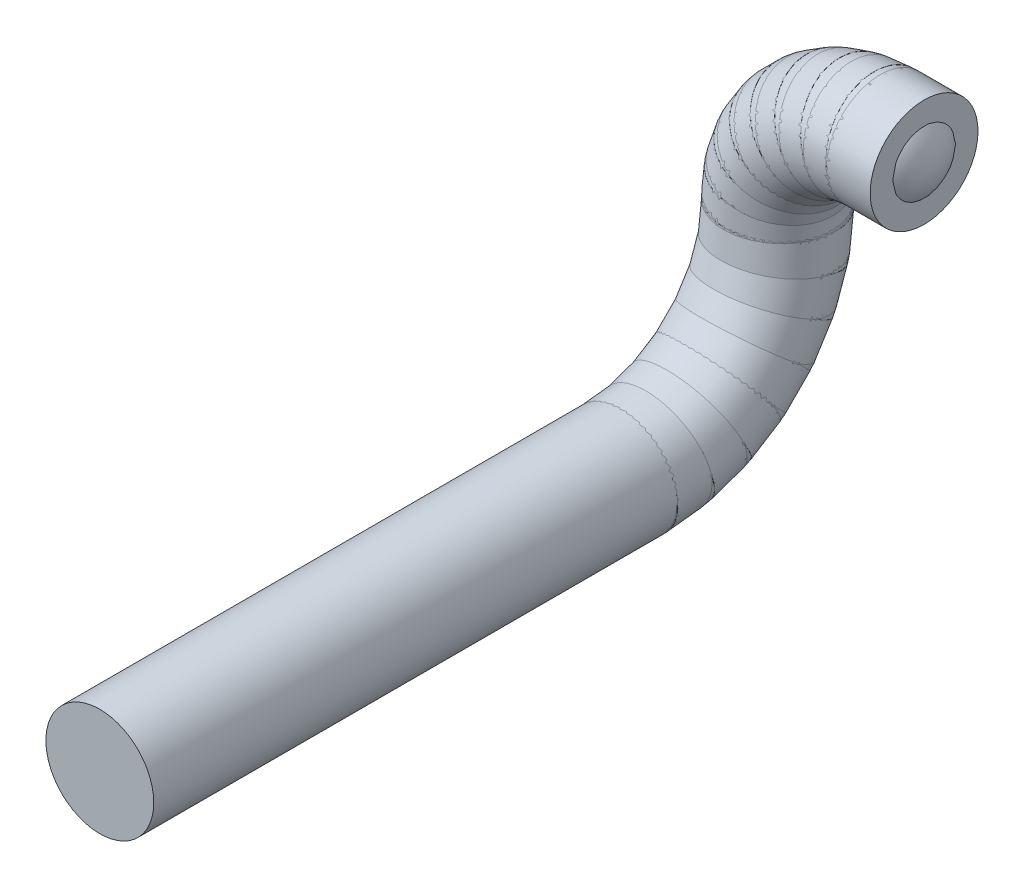
ISO-10303-21;
HEADER;
FILE_DESCRIPTION(('STEP AP214'),'2;1');
FILE_NAME('part.step','',(''),(''),'','','');
FILE_SCHEMA(('AUTOMOTIVE_DESIGN { 1 0 10303 214 1 1 1 1 }'));
ENDSEC;
DATA;
#1=APPLICATION_CONTEXT('core data for automotive mechanical design processes');
#2=APPLICATION_PROTOCOL_DEFINITION('international standard','automotive_design',2000,#1);
#3=PRODUCT_CONTEXT('',#1,'mechanical');
#4=PRODUCT('Part','Part','',(#3));
#5=PRODUCT_RELATED_PRODUCT_CATEGORY('part','',(#4));
#6=PRODUCT_DEFINITION_FORMATION('','',#4);
#7=PRODUCT_DEFINITION_CONTEXT('part definition',#1,'design');
#8=PRODUCT_DEFINITION('design','',#6,#7);
#9=PRODUCT_DEFINITION_SHAPE('','',#8);
#10=(LENGTH_UNIT() NAMED_UNIT(*) SI_UNIT(.MILLI.,.METRE.));
#11=(NAMED_UNIT(*) PLANE_ANGLE_UNIT() SI_UNIT($,.RADIAN.));
#12=(NAMED_UNIT(*) SI_UNIT($,.STERADIAN.) SOLID_ANGLE_UNIT());
#13=UNCERTAINTY_MEASURE_WITH_UNIT(LENGTH_MEASURE(1.E-05),#10,'distance_accuracy_value','');
#14=(GEOMETRIC_REPRESENTATION_CONTEXT(3) GLOBAL_UNCERTAINTY_ASSIGNED_CONTEXT((#13)) GLOBAL_UNIT_ASSIGNED_CONTEXT((#10,
#11,#12)) REPRESENTATION_CONTEXT('',''));
#15=CARTESIAN_POINT('',(0.,0.,0.));
#16=DIRECTION('',(0.,0.,1.));
#17=DIRECTION('',(1.,0.,0.));
#18=AXIS2_PLACEMENT_3D('',#15,#16,#17);
#19=CARTESIAN_POINT('',(-118.5,0.,57.));
#20=DIRECTION('',(-1.,0.,0.));
#21=DIRECTION('',(0.,0.,1.));
#22=AXIS2_PLACEMENT_3D('',#19,#20,#21);
#23=PLANE('',#22);
#24=CARTESIAN_POINT('',(-118.5,0.,57.));
#25=DIRECTION('',(-1.,0.,0.));
#26=DIRECTION('',(0.,0.,-1.));
#27=AXIS2_PLACEMENT_3D('',#24,#25,#26);
#28=CIRCLE('',#27,3.5);
#29=CARTESIAN_POINT('',(-118.5,0.,53.5));
#30=VERTEX_POINT('',#29);
#31=EDGE_CURVE('P0_E11',#30,#30,#28,.T.);
#32=ORIENTED_EDGE('',*,*,#31,.F.);
#33=EDGE_LOOP('',(#32));
#34=FACE_BOUND('',#33,.T.);
#35=ADVANCED_FACE('P0_F16',(#34),#23,.F.);
#36=CARTESIAN_POINT('',(-121.346006006,0.,57.));
#37=DIRECTION('',(-1.,0.,0.));
#38=DIRECTION('',(0.,0.,1.));
#39=AXIS2_PLACEMENT_3D('',#36,#37,#38);
#40=PLANE('',#39);
#41=CARTESIAN_POINT('',(-121.346006006,0.,57.));
#42=DIRECTION('',(-1.,0.,0.));
#43=DIRECTION('',(0.,0.,-1.));
#44=AXIS2_PLACEMENT_3D('',#41,#42,#43);
#45=CIRCLE('',#44,3.5);
#46=CARTESIAN_POINT('',(-121.346006006,0.,53.5));
#47=VERTEX_POINT('',#46);
#48=EDGE_CURVE('P0_E40',#47,#47,#45,.T.);
#49=ORIENTED_EDGE('',*,*,#48,.T.);
#50=EDGE_LOOP('',(#49));
#51=FACE_BOUND('',#50,.T.);
#52=ADVANCED_FACE('P0_F44',(#51),#40,.T.);
#53=CARTESIAN_POINT('',(-118.5,0.,57.));
#54=DIRECTION('',(-1.,0.,0.));
#55=DIRECTION('',(0.,0.,-1.));
#56=AXIS2_PLACEMENT_3D('',#53,#54,#55);
#57=CYLINDRICAL_SURFACE('',#56,3.5);
#58=ORIENTED_EDGE('',*,*,#48,.F.);
#59=DIRECTION('',(-1.,0.,0.));
#60=VECTOR('',#59,1.);
#61=CARTESIAN_POINT('',(-118.5,0.,53.5));
#62=LINE('',#61,#60);
#63=EDGE_CURVE('P0_E26',#30,#47,#62,.T.);
#64=ORIENTED_EDGE('',*,*,#63,.F.);
#65=ORIENTED_EDGE('',*,*,#31,.T.);
#66=ORIENTED_EDGE('',*,*,#63,.T.);
#67=EDGE_LOOP('',(#58,#64,#65,#66));
#68=FACE_BOUND('',#67,.T.);
#69=ADVANCED_FACE('P0_F18',(#68),#57,.T.);
#70=CLOSED_SHELL('',(#35,#52,#69));
#71=MANIFOLD_SOLID_BREP('P0_B1',#70);
#72=CARTESIAN_POINT('',(-121.346006006,0.,57.));
#73=DIRECTION('',(-0.993712209893274,-0.111964476103031,0.));
#74=DIRECTION('',(-0.111964476103031,0.993712209893274,0.));
#75=AXIS2_PLACEMENT_3D('',#72,#73,#74);
#76=PLANE('',#75);
#77=CARTESIAN_POINT('',(-121.346006006,0.,57.));
#78=DIRECTION('',(-0.993712209893274,-0.111964476103031,0.));
#79=DIRECTION('',(0.111964476103031,-0.993712209893274,0.));
#80=AXIS2_PLACEMENT_3D('',#77,#78,#79);
#81=CIRCLE('',#80,3.5);
#82=CARTESIAN_POINT('',(-120.9541303396,-3.477992734626,57.));
#83=VERTEX_POINT('',#82);
#84=EDGE_CURVE('P1_E11',#83,#83,#81,.T.);
#85=ORIENTED_EDGE('',*,*,#84,.F.);
#86=EDGE_LOOP('',(#85));
#87=FACE_BOUND('',#86,.T.);
#88=ADVANCED_FACE('P1_F16',(#87),#76,.F.);
#89=CARTESIAN_POINT('',(-122.826658964,-0.166829521759,57.));
#90=DIRECTION('',(-0.993712209893274,-0.111964476103031,0.));
#91=DIRECTION('',(-0.111964476103031,0.993712209893274,0.));
#92=AXIS2_PLACEMENT_3D('',#89,#90,#91);
#93=PLANE('',#92);
#94=CARTESIAN_POINT('',(-122.826658964,-0.166829521759,57.));
#95=DIRECTION('',(-0.993712209893274,-0.111964476103031,0.));
#96=DIRECTION('',(0.111964476103031,-0.993712209893274,0.));
#97=AXIS2_PLACEMENT_3D('',#94,#95,#96);
#98=CIRCLE('',#97,3.5);
#99=CARTESIAN_POINT('',(-122.4347832977,-3.644822256385,57.));
#100=VERTEX_POINT('',#99);
#101=EDGE_CURVE('P1_E40',#100,#100,#98,.T.);
#102=ORIENTED_EDGE('',*,*,#101,.T.);
#103=EDGE_LOOP('',(#102));
#104=FACE_BOUND('',#103,.T.);
#105=ADVANCED_FACE('P1_F43',(#104),#93,.T.);
#106=CARTESIAN_POINT('',(-121.346006006,0.,57.));
#107=DIRECTION('',(-0.993712209893274,-0.111964476103031,0.));
#108=DIRECTION('',(0.111964476103031,-0.993712209893274,0.));
#109=AXIS2_PLACEMENT_3D('',#106,#107,#108);
#110=CYLINDRICAL_SURFACE('',#109,3.5);
#111=ORIENTED_EDGE('',*,*,#101,.F.);
#112=DIRECTION('',(-0.993712209893274,-0.111964476103031,0.));
#113=VECTOR('',#112,1.);
#114=CARTESIAN_POINT('',(-120.9541303396,-3.477992734626,57.));
#115=LINE('',#114,#113);
#116=EDGE_CURVE('P1_E26',#83,#100,#115,.T.);
#117=ORIENTED_EDGE('',*,*,#116,.F.);
#118=ORIENTED_EDGE('',*,*,#84,.T.);
#119=ORIENTED_EDGE('',*,*,#116,.T.);
#120=EDGE_LOOP('',(#111,#117,#118,#119));
#121=FACE_BOUND('',#120,.T.);
#122=ADVANCED_FACE('P1_F18',(#121),#110,.T.);
#123=CLOSED_SHELL('',(#88,#105,#122));
#124=MANIFOLD_SOLID_BREP('P1_B1',#123);
#125=CARTESIAN_POINT('',(-122.826658964,-0.166829521759,57.));
#126=DIRECTION('',(-0.943883330308379,-0.330279061955133,0.));
#127=DIRECTION('',(-0.330279061955133,0.943883330308379,0.));
#128=AXIS2_PLACEMENT_3D('',#125,#126,#127);
#129=PLANE('',#128);
#130=CARTESIAN_POINT('',(-122.826658964,-0.166829521759,57.));
#131=DIRECTION('',(-0.94388333030838,-0.330279061955133,0.));
#132=DIRECTION('',(0.330279061955133,-0.94388333030838,0.));
#133=AXIS2_PLACEMENT_3D('',#130,#131,#132);
#134=CIRCLE('',#133,3.5);
#135=CARTESIAN_POINT('',(-121.6706822472,-3.470421177838,57.));
#136=VERTEX_POINT('',#135);
#137=EDGE_CURVE('P2_E11',#136,#136,#134,.T.);
#138=ORIENTED_EDGE('',*,*,#137,.F.);
#139=EDGE_LOOP('',(#138));
#140=FACE_BOUND('',#139,.T.);
#141=ADVANCED_FACE('P2_F16',(#140),#129,.F.);
#142=CARTESIAN_POINT('',(-124.2330658001,-0.658952558196,57.));
#143=DIRECTION('',(-0.943883330308379,-0.330279061955133,0.));
#144=DIRECTION('',(-0.330279061955133,0.943883330308379,0.));
#145=AXIS2_PLACEMENT_3D('',#142,#143,#144);
#146=PLANE('',#145);
#147=CARTESIAN_POINT('',(-124.2330658001,-0.658952558196,57.));
#148=DIRECTION('',(-0.94388333030838,-0.330279061955133,0.));
#149=DIRECTION('',(0.330279061955133,-0.94388333030838,0.));
#150=AXIS2_PLACEMENT_3D('',#147,#148,#149);
#151=CIRCLE('',#150,3.5);
#152=CARTESIAN_POINT('',(-123.0770890833,-3.962544214275,57.));
#153=VERTEX_POINT('',#152);
#154=EDGE_CURVE('P2_E40',#153,#153,#151,.T.);
#155=ORIENTED_EDGE('',*,*,#154,.T.);
#156=EDGE_LOOP('',(#155));
#157=FACE_BOUND('',#156,.T.);
#158=ADVANCED_FACE('P2_F43',(#157),#146,.T.);
#159=CARTESIAN_POINT('',(-122.826658964,-0.166829521759,57.));
#160=DIRECTION('',(-0.94388333030838,-0.330279061955133,0.));
#161=DIRECTION('',(0.330279061955133,-0.94388333030838,0.));
#162=AXIS2_PLACEMENT_3D('',#159,#160,#161);
#163=CYLINDRICAL_SURFACE('',#162,3.5);
#164=ORIENTED_EDGE('',*,*,#154,.F.);
#165=DIRECTION('',(-0.943883330308379,-0.330279061955133,0.));
#166=VECTOR('',#165,1.);
#167=CARTESIAN_POINT('',(-121.6706822472,-3.470421177838,57.));
#168=LINE('',#167,#166);
#169=EDGE_CURVE('P2_E19',#136,#153,#168,.T.);
#170=ORIENTED_EDGE('',*,*,#169,.F.);
#171=ORIENTED_EDGE('',*,*,#137,.T.);
#172=ORIENTED_EDGE('',*,*,#169,.T.);
#173=EDGE_LOOP('',(#164,#170,#171,#172));
#174=FACE_BOUND('',#173,.T.);
#175=ADVANCED_FACE('P2_F39',(#174),#163,.T.);
#176=CLOSED_SHELL('',(#141,#158,#175));
#177=MANIFOLD_SOLID_BREP('P2_B1',#176);
#178=CARTESIAN_POINT('',(-124.2330658001,-0.658952558196,57.));
#179=DIRECTION('',(-0.846724199228355,-0.532032076515223,0.));
#180=DIRECTION('',(-0.532032076515223,0.846724199228355,0.));
#181=AXIS2_PLACEMENT_3D('',#178,#179,#180);
#182=PLANE('',#181);
#183=CARTESIAN_POINT('',(-124.2330658001,-0.658952558196,57.));
#184=DIRECTION('',(-0.846724199228355,-0.532032076515223,0.));
#185=DIRECTION('',(0.532032076515223,-0.846724199228355,0.));
#186=AXIS2_PLACEMENT_3D('',#183,#184,#185);
#187=CIRCLE('',#186,3.5);
#188=CARTESIAN_POINT('',(-122.3709535323,-3.622487255495,57.));
#189=VERTEX_POINT('',#188);
#190=EDGE_CURVE('P3_E11',#189,#189,#187,.T.);
#191=ORIENTED_EDGE('',*,*,#190,.F.);
#192=EDGE_LOOP('',(#191));
#193=FACE_BOUND('',#192,.T.);
#194=ADVANCED_FACE('P3_F16',(#193),#182,.F.);
#195=CARTESIAN_POINT('',(-125.4947034028,-1.451692005336,57.));
#196=DIRECTION('',(-0.846724199228355,-0.532032076515223,0.));
#197=DIRECTION('',(-0.532032076515223,0.846724199228355,0.));
#198=AXIS2_PLACEMENT_3D('',#195,#196,#197);
#199=PLANE('',#198);
#200=CARTESIAN_POINT('',(-125.4947034028,-1.451692005336,57.));
#201=DIRECTION('',(-0.846724199228355,-0.532032076515223,0.));
#202=DIRECTION('',(0.532032076515223,-0.846724199228355,0.));
#203=AXIS2_PLACEMENT_3D('',#200,#201,#202);
#204=CIRCLE('',#203,3.5);
#205=CARTESIAN_POINT('',(-123.632591135,-4.415226702635,57.));
#206=VERTEX_POINT('',#205);
#207=EDGE_CURVE('P3_E41',#206,#206,#204,.T.);
#208=ORIENTED_EDGE('',*,*,#207,.T.);
#209=EDGE_LOOP('',(#208));
#210=FACE_BOUND('',#209,.T.);
#211=ADVANCED_FACE('P3_F44',(#210),#199,.T.);
#212=CARTESIAN_POINT('',(-124.2330658001,-0.658952558196,57.));
#213=DIRECTION('',(-0.846724199228355,-0.532032076515223,0.));
#214=DIRECTION('',(0.532032076515223,-0.846724199228355,0.));
#215=AXIS2_PLACEMENT_3D('',#212,#213,#214);
#216=CYLINDRICAL_SURFACE('',#215,3.5);
#217=ORIENTED_EDGE('',*,*,#207,.F.);
#218=DIRECTION('',(-0.846724199228355,-0.532032076515223,0.));
#219=VECTOR('',#218,1.);
#220=CARTESIAN_POINT('',(-122.3709535323,-3.622487255495,57.));
#221=LINE('',#220,#219);
#222=EDGE_CURVE('P3_E19',#189,#206,#221,.T.);
#223=ORIENTED_EDGE('',*,*,#222,.F.);
#224=ORIENTED_EDGE('',*,*,#190,.T.);
#225=ORIENTED_EDGE('',*,*,#222,.T.);
#226=EDGE_LOOP('',(#217,#223,#224,#225));
#227=FACE_BOUND('',#226,.T.);
#228=ADVANCED_FACE('P3_F40',(#227),#216,.T.);
#229=CLOSED_SHELL('',(#194,#211,#228));
#230=MANIFOLD_SOLID_BREP('P3_B1',#229);
#231=CARTESIAN_POINT('',(-125.4947034028,-1.451692005336,57.));
#232=DIRECTION('',(-0.707106781186548,-0.707106781186548,0.));
#233=DIRECTION('',(-0.707106781186548,0.707106781186548,0.));
#234=AXIS2_PLACEMENT_3D('',#231,#232,#233);
#235=PLANE('',#234);
#236=CARTESIAN_POINT('',(-125.4947034028,-1.451692005336,57.));
#237=DIRECTION('',(-0.707106781186548,-0.707106781186548,0.));
#238=DIRECTION('',(0.707106781186548,-0.707106781186548,0.));
#239=AXIS2_PLACEMENT_3D('',#236,#237,#238);
#240=CIRCLE('',#239,3.5);
#241=CARTESIAN_POINT('',(-123.0198296687,-3.926565739489,57.));
#242=VERTEX_POINT('',#241);
#243=EDGE_CURVE('P4_E11',#242,#242,#240,.T.);
#244=ORIENTED_EDGE('',*,*,#243,.F.);
#245=EDGE_LOOP('',(#244));
#246=FACE_BOUND('',#245,.T.);
#247=ADVANCED_FACE('P4_F16',(#246),#235,.F.);
#248=CARTESIAN_POINT('',(-126.5483079946,-2.505296597109,57.));
#249=DIRECTION('',(-0.707106781186548,-0.707106781186548,0.));
#250=DIRECTION('',(-0.707106781186548,0.707106781186548,0.));
#251=AXIS2_PLACEMENT_3D('',#248,#249,#250);
#252=PLANE('',#251);
#253=CARTESIAN_POINT('',(-126.5483079946,-2.505296597109,57.));
#254=DIRECTION('',(-0.707106781186548,-0.707106781186548,0.));
#255=DIRECTION('',(0.707106781186548,-0.707106781186548,0.));
#256=AXIS2_PLACEMENT_3D('',#253,#254,#255);
#257=CIRCLE('',#256,3.5);
#258=CARTESIAN_POINT('',(-124.0734342605,-4.980170331262,57.));
#259=VERTEX_POINT('',#258);
#260=EDGE_CURVE('P4_E40',#259,#259,#257,.T.);
#261=ORIENTED_EDGE('',*,*,#260,.T.);
#262=EDGE_LOOP('',(#261));
#263=FACE_BOUND('',#262,.T.);
#264=ADVANCED_FACE('P4_F43',(#263),#252,.T.);
#265=CARTESIAN_POINT('',(-125.4947034028,-1.451692005336,57.));
#266=DIRECTION('',(-0.707106781186548,-0.707106781186548,0.));
#267=DIRECTION('',(0.707106781186548,-0.707106781186548,0.));
#268=AXIS2_PLACEMENT_3D('',#265,#266,#267);
#269=CYLINDRICAL_SURFACE('',#268,3.5);
#270=ORIENTED_EDGE('',*,*,#260,.F.);
#271=DIRECTION('',(-0.707106781186548,-0.707106781186548,0.));
#272=VECTOR('',#271,1.);
#273=CARTESIAN_POINT('',(-123.0198296687,-3.926565739489,57.));
#274=LINE('',#273,#272);
#275=EDGE_CURVE('P4_E19',#242,#259,#274,.T.);
#276=ORIENTED_EDGE('',*,*,#275,.F.);
#277=ORIENTED_EDGE('',*,*,#243,.T.);
#278=ORIENTED_EDGE('',*,*,#275,.T.);
#279=EDGE_LOOP('',(#270,#276,#277,#278));
#280=FACE_BOUND('',#279,.T.);
#281=ADVANCED_FACE('P4_F39',(#280),#269,.T.);
#282=CLOSED_SHELL('',(#247,#264,#281));
#283=MANIFOLD_SOLID_BREP('P4_B1',#282);
#284=CARTESIAN_POINT('',(-126.5483079946,-2.505296597109,57.));
#285=DIRECTION('',(-0.532032076515223,-0.846724199228355,0.));
#286=DIRECTION('',(-0.846724199228355,0.532032076515223,0.));
#287=AXIS2_PLACEMENT_3D('',#284,#285,#286);
#288=PLANE('',#287);
#289=CARTESIAN_POINT('',(-126.5483079946,-2.505296597109,57.));
#290=DIRECTION('',(-0.532032076515223,-0.846724199228355,0.));
#291=DIRECTION('',(-0.846724199228355,0.532032076515223,0.));
#292=AXIS2_PLACEMENT_3D('',#289,#290,#291);
#293=CIRCLE('',#292,3.5);
#294=CARTESIAN_POINT('',(-129.5118426919,-0.643184329306,57.));
#295=VERTEX_POINT('',#294);
#296=EDGE_CURVE('P5_E11',#295,#295,#293,.T.);
#297=ORIENTED_EDGE('',*,*,#296,.F.);
#298=EDGE_LOOP('',(#297));
#299=FACE_BOUND('',#298,.T.);
#300=ADVANCED_FACE('P5_F16',(#299),#288,.F.);
#301=CARTESIAN_POINT('',(-127.3410474418,-3.766934199814,57.));
#302=DIRECTION('',(-0.532032076515223,-0.846724199228355,0.));
#303=DIRECTION('',(-0.846724199228355,0.532032076515223,0.));
#304=AXIS2_PLACEMENT_3D('',#301,#302,#303);
#305=PLANE('',#304);
#306=CARTESIAN_POINT('',(-127.3410474418,-3.766934199814,57.));
#307=DIRECTION('',(-0.532032076515223,-0.846724199228355,0.));
#308=DIRECTION('',(-0.846724199228355,0.532032076515223,0.));
#309=AXIS2_PLACEMENT_3D('',#306,#307,#308);
#310=CIRCLE('',#309,3.5);
#311=CARTESIAN_POINT('',(-130.3045821391,-1.90482193201,57.));
#312=VERTEX_POINT('',#311);
#313=EDGE_CURVE('P5_E42',#312,#312,#310,.T.);
#314=ORIENTED_EDGE('',*,*,#313,.T.);
#315=EDGE_LOOP('',(#314));
#316=FACE_BOUND('',#315,.T.);
#317=ADVANCED_FACE('P5_F18',(#316),#305,.T.);
#318=CARTESIAN_POINT('',(-126.5483079946,-2.505296597109,57.));
#319=DIRECTION('',(-0.532032076515223,-0.846724199228355,0.));
#320=DIRECTION('',(-0.846724199228355,0.532032076515223,0.));
#321=AXIS2_PLACEMENT_3D('',#318,#319,#320);
#322=CYLINDRICAL_SURFACE('',#321,3.5);
#323=ORIENTED_EDGE('',*,*,#313,.F.);
#324=DIRECTION('',(-0.532032076515223,-0.846724199228355,0.));
#325=VECTOR('',#324,1.);
#326=CARTESIAN_POINT('',(-129.5118426919,-0.643184329306,57.));
#327=LINE('',#326,#325);
#328=EDGE_CURVE('P5_E20',#295,#312,#327,.T.);
#329=ORIENTED_EDGE('',*,*,#328,.F.);
#330=ORIENTED_EDGE('',*,*,#296,.T.);
#331=ORIENTED_EDGE('',*,*,#328,.T.);
#332=EDGE_LOOP('',(#323,#329,#330,#331));
#333=FACE_BOUND('',#332,.T.);
#334=ADVANCED_FACE('P5_F41',(#333),#322,.T.);
#335=CLOSED_SHELL('',(#300,#317,#334));
#336=MANIFOLD_SOLID_BREP('P5_B1',#335);
#337=CARTESIAN_POINT('',(-127.3410474418,-3.766934199814,57.));
#338=DIRECTION('',(-0.330279061955133,-0.943883330308379,0.));
#339=DIRECTION('',(-0.943883330308379,0.330279061955133,0.));
#340=AXIS2_PLACEMENT_3D('',#337,#338,#339);
#341=PLANE('',#340);
#342=CARTESIAN_POINT('',(-127.3410474418,-3.766934199814,57.));
#343=DIRECTION('',(-0.330279061955133,-0.94388333030838,0.));
#344=DIRECTION('',(-0.94388333030838,0.330279061955133,0.));
#345=AXIS2_PLACEMENT_3D('',#342,#343,#344);
#346=CIRCLE('',#345,3.5);
#347=CARTESIAN_POINT('',(-130.6446390978,-2.610957482971,57.));
#348=VERTEX_POINT('',#347);
#349=EDGE_CURVE('P6_E11',#348,#348,#346,.T.);
#350=ORIENTED_EDGE('',*,*,#349,.F.);
#351=EDGE_LOOP('',(#350));
#352=FACE_BOUND('',#351,.T.);
#353=ADVANCED_FACE('P6_F16',(#352),#341,.F.);
#354=CARTESIAN_POINT('',(-127.8331704782,-5.173341035911,57.));
#355=DIRECTION('',(-0.330279061955133,-0.943883330308379,0.));
#356=DIRECTION('',(-0.943883330308379,0.330279061955133,0.));
#357=AXIS2_PLACEMENT_3D('',#354,#355,#356);
#358=PLANE('',#357);
#359=CARTESIAN_POINT('',(-127.8331704782,-5.173341035911,57.));
#360=DIRECTION('',(-0.330279061955133,-0.94388333030838,0.));
#361=DIRECTION('',(-0.94388333030838,0.330279061955133,0.));
#362=AXIS2_PLACEMENT_3D('',#359,#360,#361);
#363=CIRCLE('',#362,3.5);
#364=CARTESIAN_POINT('',(-131.1367621343,-4.017364319068,57.));
#365=VERTEX_POINT('',#364);
#366=EDGE_CURVE('P6_E41',#365,#365,#363,.T.);
#367=ORIENTED_EDGE('',*,*,#366,.T.);
#368=EDGE_LOOP('',(#367));
#369=FACE_BOUND('',#368,.T.);
#370=ADVANCED_FACE('P6_F44',(#369),#358,.T.);
#371=CARTESIAN_POINT('',(-127.3410474418,-3.766934199814,57.));
#372=DIRECTION('',(-0.330279061955133,-0.94388333030838,0.));
#373=DIRECTION('',(-0.94388333030838,0.330279061955133,0.));
#374=AXIS2_PLACEMENT_3D('',#371,#372,#373);
#375=CYLINDRICAL_SURFACE('',#374,3.5);
#376=ORIENTED_EDGE('',*,*,#366,.F.);
#377=DIRECTION('',(-0.330279061955133,-0.943883330308379,0.));
#378=VECTOR('',#377,1.);
#379=CARTESIAN_POINT('',(-130.6446390978,-2.610957482971,57.));
#380=LINE('',#379,#378);
#381=EDGE_CURVE('P6_E19',#348,#365,#380,.T.);
#382=ORIENTED_EDGE('',*,*,#381,.F.);
#383=ORIENTED_EDGE('',*,*,#349,.T.);
#384=ORIENTED_EDGE('',*,*,#381,.T.);
#385=EDGE_LOOP('',(#376,#382,#383,#384));
#386=FACE_BOUND('',#385,.T.);
#387=ADVANCED_FACE('P6_F40',(#386),#375,.T.);
#388=CLOSED_SHELL('',(#353,#370,#387));
#389=MANIFOLD_SOLID_BREP('P6_B1',#388);
#390=CARTESIAN_POINT('',(-127.8331704782,-5.173341035911,57.));
#391=DIRECTION('',(-0.111964476103031,-0.993712209893274,0.));
#392=DIRECTION('',(-0.993712209893274,0.111964476103031,0.));
#393=AXIS2_PLACEMENT_3D('',#390,#391,#392);
#394=PLANE('',#393);
#395=CARTESIAN_POINT('',(-127.8331704782,-5.173341035911,57.));
#396=DIRECTION('',(-0.111964476103031,-0.993712209893274,0.));
#397=DIRECTION('',(-0.993712209893274,0.111964476103031,0.));
#398=AXIS2_PLACEMENT_3D('',#395,#396,#397);
#399=CIRCLE('',#398,3.5);
#400=CARTESIAN_POINT('',(-131.3111632128,-4.781465369549,57.));
#401=VERTEX_POINT('',#400);
#402=EDGE_CURVE('P7_E11',#401,#401,#399,.T.);
#403=ORIENTED_EDGE('',*,*,#402,.F.);
#404=EDGE_LOOP('',(#403));
#405=FACE_BOUND('',#404,.T.);
#406=ADVANCED_FACE('P7_F16',(#405),#394,.F.);
#407=CARTESIAN_POINT('',(-128.,-6.653993993994,57.));
#408=DIRECTION('',(-0.111964476103031,-0.993712209893274,0.));
#409=DIRECTION('',(-0.993712209893274,0.111964476103031,0.));
#410=AXIS2_PLACEMENT_3D('',#407,#408,#409);
#411=PLANE('',#410);
#412=CARTESIAN_POINT('',(-128.,-6.653993993994,57.));
#413=DIRECTION('',(-0.111964476103031,-0.993712209893274,0.));
#414=DIRECTION('',(-0.993712209893274,0.111964476103031,0.));
#415=AXIS2_PLACEMENT_3D('',#412,#413,#414);
#416=CIRCLE('',#415,3.5);
#417=CARTESIAN_POINT('',(-131.4779927346,-6.262118327632,57.));
#418=VERTEX_POINT('',#417);
#419=EDGE_CURVE('P7_E40',#418,#418,#416,.T.);
#420=ORIENTED_EDGE('',*,*,#419,.T.);
#421=EDGE_LOOP('',(#420));
#422=FACE_BOUND('',#421,.T.);
#423=ADVANCED_FACE('P7_F43',(#422),#411,.T.);
#424=CARTESIAN_POINT('',(-127.8331704782,-5.173341035911,57.));
#425=DIRECTION('',(-0.111964476103031,-0.993712209893274,0.));
#426=DIRECTION('',(-0.993712209893274,0.111964476103031,0.));
#427=AXIS2_PLACEMENT_3D('',#424,#425,#426);
#428=CYLINDRICAL_SURFACE('',#427,3.5);
#429=ORIENTED_EDGE('',*,*,#419,.F.);
#430=DIRECTION('',(-0.111964476103031,-0.993712209893274,0.));
#431=VECTOR('',#430,1.);
#432=CARTESIAN_POINT('',(-131.3111632128,-4.781465369549,57.));
#433=LINE('',#432,#431);
#434=EDGE_CURVE('P7_E24',#401,#418,#433,.T.);
#435=ORIENTED_EDGE('',*,*,#434,.F.);
#436=ORIENTED_EDGE('',*,*,#402,.T.);
#437=ORIENTED_EDGE('',*,*,#434,.T.);
#438=EDGE_LOOP('',(#429,#435,#436,#437));
#439=FACE_BOUND('',#438,.T.);
#440=ADVANCED_FACE('P7_F39',(#439),#428,.T.);
#441=CLOSED_SHELL('',(#406,#423,#440));
#442=MANIFOLD_SOLID_BREP('P7_B1',#441);
#443=CARTESIAN_POINT('',(-128.,-6.653993993994,57.));
#444=DIRECTION('',(0.,-1.,0.));
#445=DIRECTION('',(0.,0.,-1.));
#446=AXIS2_PLACEMENT_3D('',#443,#444,#445);
#447=PLANE('',#446);
#448=CARTESIAN_POINT('',(-128.,-6.653993993994,57.));
#449=DIRECTION('',(0.,-1.,0.));
#450=DIRECTION('',(0.,0.,-1.));
#451=AXIS2_PLACEMENT_3D('',#448,#449,#450);
#452=CIRCLE('',#451,3.5);
#453=CARTESIAN_POINT('',(-128.,-6.653993993994,53.5));
#454=VERTEX_POINT('',#453);
#455=EDGE_CURVE('P8_E11',#454,#454,#452,.T.);
#456=ORIENTED_EDGE('',*,*,#455,.F.);
#457=EDGE_LOOP('',(#456));
#458=FACE_BOUND('',#457,.T.);
#459=ADVANCED_FACE('P8_F16',(#458),#447,.F.);
#460=CARTESIAN_POINT('',(-128.,-6.993993993994,57.));
#461=DIRECTION('',(0.,-1.,0.));
#462=DIRECTION('',(0.,0.,-1.));
#463=AXIS2_PLACEMENT_3D('',#460,#461,#462);
#464=PLANE('',#463);
#465=CARTESIAN_POINT('',(-128.,-6.993993993994,57.));
#466=DIRECTION('',(0.,-1.,0.));
#467=DIRECTION('',(0.,0.,-1.));
#468=AXIS2_PLACEMENT_3D('',#465,#466,#467);
#469=CIRCLE('',#468,3.5);
#470=CARTESIAN_POINT('',(-128.,-6.993993993994,53.5));
#471=VERTEX_POINT('',#470);
#472=EDGE_CURVE('P8_E19',#471,#471,#469,.T.);
#473=ORIENTED_EDGE('',*,*,#472,.T.);
#474=EDGE_LOOP('',(#473));
#475=FACE_BOUND('',#474,.T.);
#476=ADVANCED_FACE('P8_F44',(#475),#464,.T.);
#477=CARTESIAN_POINT('',(-128.,-6.653993993994,57.));
#478=DIRECTION('',(0.,-1.,0.));
#479=DIRECTION('',(0.,0.,-1.));
#480=AXIS2_PLACEMENT_3D('',#477,#478,#479);
#481=CYLINDRICAL_SURFACE('',#480,3.5);
#482=ORIENTED_EDGE('',*,*,#472,.F.);
#483=DIRECTION('',(0.,-1.,0.));
#484=VECTOR('',#483,1.);
#485=CARTESIAN_POINT('',(-128.,-6.653993993994,53.5));
#486=LINE('',#485,#484);
#487=EDGE_CURVE('P8_E25',#454,#471,#486,.T.);
#488=ORIENTED_EDGE('',*,*,#487,.F.);
#489=ORIENTED_EDGE('',*,*,#455,.T.);
#490=ORIENTED_EDGE('',*,*,#487,.T.);
#491=EDGE_LOOP('',(#482,#488,#489,#490));
#492=FACE_BOUND('',#491,.T.);
#493=ADVANCED_FACE('P8_F41',(#492),#481,.T.);
#494=CLOSED_SHELL('',(#459,#476,#493));
#495=MANIFOLD_SOLID_BREP('P8_B1',#494);
#496=CARTESIAN_POINT('',(-128.,-6.993993993994,57.));
#497=DIRECTION('',(0.,-0.993712209893274,0.111964476103031));
#498=DIRECTION('',(-1.,0.,0.));
#499=AXIS2_PLACEMENT_3D('',#496,#497,#498);
#500=PLANE('',#499);
#501=CARTESIAN_POINT('',(-128.,-6.993993993994,57.));
#502=DIRECTION('',(0.,-0.993712209893274,0.111964476103031));
#503=DIRECTION('',(0.,-0.111964476103031,-0.993712209893274));
#504=AXIS2_PLACEMENT_3D('',#501,#502,#503);
#505=CIRCLE('',#504,3.5);
#506=CARTESIAN_POINT('',(-128.,-7.385869660356,53.522007265374));
#507=VERTEX_POINT('',#506);
#508=EDGE_CURVE('P9_E11',#507,#507,#505,.T.);
#509=ORIENTED_EDGE('',*,*,#508,.F.);
#510=EDGE_LOOP('',(#509));
#511=FACE_BOUND('',#510,.T.);
#512=ADVANCED_FACE('P9_F16',(#511),#500,.F.);
#513=CARTESIAN_POINT('',(-128.,-9.220539795623,57.250871461292));
#514=DIRECTION('',(0.,-0.993712209893274,0.111964476103031));
#515=DIRECTION('',(-1.,0.,0.));
#516=AXIS2_PLACEMENT_3D('',#513,#514,#515);
#517=PLANE('',#516);
#518=CARTESIAN_POINT('',(-128.,-9.220539795623,57.250871461292));
#519=DIRECTION('',(0.,-0.993712209893274,0.111964476103031));
#520=DIRECTION('',(0.,-0.111964476103031,-0.993712209893274));
#521=AXIS2_PLACEMENT_3D('',#518,#519,#520);
#522=CIRCLE('',#521,3.5);
#523=CARTESIAN_POINT('',(-128.,-9.612415461985,53.772878726665));
#524=VERTEX_POINT('',#523);
#525=EDGE_CURVE('P9_E19',#524,#524,#522,.T.);
#526=ORIENTED_EDGE('',*,*,#525,.T.);
#527=EDGE_LOOP('',(#526));
#528=FACE_BOUND('',#527,.T.);
#529=ADVANCED_FACE('P9_F44',(#528),#517,.T.);
#530=CARTESIAN_POINT('',(-128.,-6.993993993994,57.));
#531=DIRECTION('',(0.,-0.993712209893274,0.111964476103031));
#532=DIRECTION('',(0.,-0.111964476103031,-0.993712209893274));
#533=AXIS2_PLACEMENT_3D('',#530,#531,#532);
#534=CYLINDRICAL_SURFACE('',#533,3.5);
#535=ORIENTED_EDGE('',*,*,#525,.F.);
#536=DIRECTION('',(0.,-0.993712209893274,0.111964476103031));
#537=VECTOR('',#536,1.);
#538=CARTESIAN_POINT('',(-128.,-7.385869660356,53.522007265374));
#539=LINE('',#538,#537);
#540=EDGE_CURVE('P9_E26',#507,#524,#539,.T.);
#541=ORIENTED_EDGE('',*,*,#540,.F.);
#542=ORIENTED_EDGE('',*,*,#508,.T.);
#543=ORIENTED_EDGE('',*,*,#540,.T.);
#544=EDGE_LOOP('',(#535,#541,#542,#543));
#545=FACE_BOUND('',#544,.T.);
#546=ADVANCED_FACE('P9_F40',(#545),#534,.T.);
#547=CLOSED_SHELL('',(#512,#529,#546));
#548=MANIFOLD_SOLID_BREP('P9_B1',#547);
#549=CARTESIAN_POINT('',(-128.,-9.220539795623,57.250871461292));
#550=DIRECTION('',(0.,-0.943883330308379,0.330279061955133));
#551=DIRECTION('',(-1.,0.,0.));
#552=AXIS2_PLACEMENT_3D('',#549,#550,#551);
#553=PLANE('',#552);
#554=CARTESIAN_POINT('',(-128.,-9.220539795623,57.250871461292));
#555=DIRECTION('',(0.,-0.94388333030838,0.330279061955133));
#556=DIRECTION('',(0.,-0.330279061955133,-0.94388333030838));
#557=AXIS2_PLACEMENT_3D('',#554,#555,#556);
#558=CIRCLE('',#557,3.5);
#559=CARTESIAN_POINT('',(-128.,-10.37651651246,53.947279805212));
#560=VERTEX_POINT('',#559);
#561=EDGE_CURVE('P10_E11',#560,#560,#558,.T.);
#562=ORIENTED_EDGE('',*,*,#561,.F.);
#563=EDGE_LOOP('',(#562));
#564=FACE_BOUND('',#563,.T.);
#565=ADVANCED_FACE('P10_F16',(#564),#553,.F.);
#566=CARTESIAN_POINT('',(-128.,-11.33543729351,57.99090610255));
#567=DIRECTION('',(0.,-0.943883330308379,0.330279061955133));
#568=DIRECTION('',(-1.,0.,0.));
#569=AXIS2_PLACEMENT_3D('',#566,#567,#568);
#570=PLANE('',#569);
#571=CARTESIAN_POINT('',(-128.,-11.33543729351,57.99090610255));
#572=DIRECTION('',(0.,-0.94388333030838,0.330279061955133));
#573=DIRECTION('',(0.,-0.330279061955133,-0.94388333030838));
#574=AXIS2_PLACEMENT_3D('',#571,#572,#573);
#575=CIRCLE('',#574,3.5);
#576=CARTESIAN_POINT('',(-128.,-12.49141401035,54.687314446471));
#577=VERTEX_POINT('',#576);
#578=EDGE_CURVE('P10_E41',#577,#577,#575,.T.);
#579=ORIENTED_EDGE('',*,*,#578,.T.);
#580=EDGE_LOOP('',(#579));
#581=FACE_BOUND('',#580,.T.);
#582=ADVANCED_FACE('P10_F18',(#581),#570,.T.);
#583=CARTESIAN_POINT('',(-128.,-9.220539795623,57.250871461292));
#584=DIRECTION('',(0.,-0.94388333030838,0.330279061955133));
#585=DIRECTION('',(0.,-0.330279061955133,-0.94388333030838));
#586=AXIS2_PLACEMENT_3D('',#583,#584,#585);
#587=CYLINDRICAL_SURFACE('',#586,3.5);
#588=ORIENTED_EDGE('',*,*,#578,.F.);
#589=DIRECTION('',(0.,-0.943883330308379,0.330279061955133));
#590=VECTOR('',#589,1.);
#591=CARTESIAN_POINT('',(-128.,-10.37651651246,53.947279805212));
#592=LINE('',#591,#590);
#593=EDGE_CURVE('P10_E26',#560,#577,#592,.T.);
#594=ORIENTED_EDGE('',*,*,#593,.F.);
#595=ORIENTED_EDGE('',*,*,#561,.T.);
#596=ORIENTED_EDGE('',*,*,#593,.T.);
#597=EDGE_LOOP('',(#588,#594,#595,#596));
#598=FACE_BOUND('',#597,.T.);
#599=ADVANCED_FACE('P10_F40',(#598),#587,.T.);
#600=CLOSED_SHELL('',(#565,#582,#599));
#601=MANIFOLD_SOLID_BREP('P10_B1',#600);
#602=CARTESIAN_POINT('',(-128.,-11.33543729351,57.99090610255));
#603=DIRECTION('',(0.,-0.846724199228355,0.532032076515223));
#604=DIRECTION('',(-1.,0.,0.));
#605=AXIS2_PLACEMENT_3D('',#602,#603,#604);
#606=PLANE('',#605);
#607=CARTESIAN_POINT('',(-128.,-11.33543729351,57.99090610255));
#608=DIRECTION('',(0.,-0.846724199228355,0.532032076515223));
#609=DIRECTION('',(0.,-0.532032076515223,-0.846724199228355));
#610=AXIS2_PLACEMENT_3D('',#607,#608,#609);
#611=CIRCLE('',#610,3.5);
#612=CARTESIAN_POINT('',(-128.,-13.19754956131,55.027371405251));
#613=VERTEX_POINT('',#612);
#614=EDGE_CURVE('P11_E11',#613,#613,#611,.T.);
#615=ORIENTED_EDGE('',*,*,#614,.F.);
#616=EDGE_LOOP('',(#615));
#617=FACE_BOUND('',#616,.T.);
#618=ADVANCED_FACE('P11_F16',(#617),#606,.F.);
#619=CARTESIAN_POINT('',(-128.,-13.23263669607,59.182995496746));
#620=DIRECTION('',(0.,-0.846724199228355,0.532032076515223));
#621=DIRECTION('',(-1.,0.,0.));
#622=AXIS2_PLACEMENT_3D('',#619,#620,#621);
#623=PLANE('',#622);
#624=CARTESIAN_POINT('',(-128.,-13.23263669607,59.182995496746));
#625=DIRECTION('',(0.,-0.846724199228355,0.532032076515223));
#626=DIRECTION('',(0.,-0.532032076515223,-0.846724199228355));
#627=AXIS2_PLACEMENT_3D('',#624,#625,#626);
#628=CIRCLE('',#627,3.5);
#629=CARTESIAN_POINT('',(-128.,-15.09474896388,56.219460799447));
#630=VERTEX_POINT('',#629);
#631=EDGE_CURVE('P11_E41',#630,#630,#628,.T.);
#632=ORIENTED_EDGE('',*,*,#631,.T.);
#633=EDGE_LOOP('',(#632));
#634=FACE_BOUND('',#633,.T.);
#635=ADVANCED_FACE('P11_F18',(#634),#623,.T.);
#636=CARTESIAN_POINT('',(-128.,-11.33543729351,57.99090610255));
#637=DIRECTION('',(0.,-0.846724199228355,0.532032076515223));
#638=DIRECTION('',(0.,-0.532032076515223,-0.846724199228355));
#639=AXIS2_PLACEMENT_3D('',#636,#637,#638);
#640=CYLINDRICAL_SURFACE('',#639,3.5);
#641=ORIENTED_EDGE('',*,*,#631,.F.);
#642=DIRECTION('',(0.,-0.846724199228355,0.532032076515223));
#643=VECTOR('',#642,1.);
#644=CARTESIAN_POINT('',(-128.,-13.19754956131,55.027371405251));
#645=LINE('',#644,#643);
#646=EDGE_CURVE('P11_E26',#613,#630,#645,.T.);
#647=ORIENTED_EDGE('',*,*,#646,.F.);
#648=ORIENTED_EDGE('',*,*,#614,.T.);
#649=ORIENTED_EDGE('',*,*,#646,.T.);
#650=EDGE_LOOP('',(#641,#647,#648,#649));
#651=FACE_BOUND('',#650,.T.);
#652=ADVANCED_FACE('P11_F40',(#651),#640,.T.);
#653=CLOSED_SHELL('',(#618,#635,#652));
#654=MANIFOLD_SOLID_BREP('P11_B1',#653);
#655=CARTESIAN_POINT('',(-128.,-13.23263669607,59.182995496746));
#656=DIRECTION('',(0.,-0.707106781186548,0.707106781186548));
#657=DIRECTION('',(-1.,0.,0.));
#658=AXIS2_PLACEMENT_3D('',#655,#656,#657);
#659=PLANE('',#658);
#660=CARTESIAN_POINT('',(-128.,-13.23263669607,59.182995496746));
#661=DIRECTION('',(0.,-0.707106781186548,0.707106781186548));
#662=DIRECTION('',(0.,-0.707106781186548,-0.707106781186548));
#663=AXIS2_PLACEMENT_3D('',#660,#661,#662);
#664=CIRCLE('',#663,3.5);
#665=CARTESIAN_POINT('',(-128.,-15.70751043022,56.708121762593));
#666=VERTEX_POINT('',#665);
#667=EDGE_CURVE('P12_E11',#666,#666,#664,.T.);
#668=ORIENTED_EDGE('',*,*,#667,.F.);
#669=EDGE_LOOP('',(#668));
#670=FACE_BOUND('',#669,.T.);
#671=ADVANCED_FACE('P12_F16',(#670),#659,.F.);
#672=CARTESIAN_POINT('',(-128.,-14.81700450325,60.767363303924));
#673=DIRECTION('',(0.,-0.707106781186548,0.707106781186548));
#674=DIRECTION('',(-1.,0.,0.));
#675=AXIS2_PLACEMENT_3D('',#672,#673,#674);
#676=PLANE('',#675);
#677=CARTESIAN_POINT('',(-128.,-14.81700450325,60.767363303924));
#678=DIRECTION('',(0.,-0.707106781186548,0.707106781186548));
#679=DIRECTION('',(0.,-0.707106781186548,-0.707106781186548));
#680=AXIS2_PLACEMENT_3D('',#677,#678,#679);
#681=CIRCLE('',#680,3.5);
#682=CARTESIAN_POINT('',(-128.,-17.2918782374,58.292489569771));
#683=VERTEX_POINT('',#682);
#684=EDGE_CURVE('P12_E40',#683,#683,#681,.T.);
#685=ORIENTED_EDGE('',*,*,#684,.T.);
#686=EDGE_LOOP('',(#685));
#687=FACE_BOUND('',#686,.T.);
#688=ADVANCED_FACE('P12_F44',(#687),#676,.T.);
#689=CARTESIAN_POINT('',(-128.,-13.23263669607,59.182995496746));
#690=DIRECTION('',(0.,-0.707106781186548,0.707106781186548));
#691=DIRECTION('',(0.,-0.707106781186548,-0.707106781186548));
#692=AXIS2_PLACEMENT_3D('',#689,#690,#691);
#693=CYLINDRICAL_SURFACE('',#692,3.5);
#694=ORIENTED_EDGE('',*,*,#684,.F.);
#695=DIRECTION('',(0.,-0.707106781186548,0.707106781186548));
#696=VECTOR('',#695,1.);
#697=CARTESIAN_POINT('',(-128.,-15.70751043022,56.708121762593));
#698=LINE('',#697,#696);
#699=EDGE_CURVE('P12_E25',#666,#683,#698,.T.);
#700=ORIENTED_EDGE('',*,*,#699,.F.);
#701=ORIENTED_EDGE('',*,*,#667,.T.);
#702=ORIENTED_EDGE('',*,*,#699,.T.);
#703=EDGE_LOOP('',(#694,#700,#701,#702));
#704=FACE_BOUND('',#703,.T.);
#705=ADVANCED_FACE('P12_F39',(#704),#693,.T.);
#706=CLOSED_SHELL('',(#671,#688,#705));
#707=MANIFOLD_SOLID_BREP('P12_B1',#706);
#708=CARTESIAN_POINT('',(-128.,-14.81700450325,60.767363303924));
#709=DIRECTION('',(0.,-0.532032076515223,0.846724199228355));
#710=DIRECTION('',(-1.,0.,0.));
#711=AXIS2_PLACEMENT_3D('',#708,#709,#710);
#712=PLANE('',#711);
#713=CARTESIAN_POINT('',(-128.,-14.81700450325,60.767363303924));
#714=DIRECTION('',(0.,-0.532032076515223,0.846724199228355));
#715=DIRECTION('',(0.,0.846724199228355,0.532032076515223));
#716=AXIS2_PLACEMENT_3D('',#713,#714,#715);
#717=CIRCLE('',#716,3.5);
#718=CARTESIAN_POINT('',(-128.,-11.85346980595,62.629475571728));
#719=VERTEX_POINT('',#718);
#720=EDGE_CURVE('P13_E11',#719,#719,#717,.T.);
#721=ORIENTED_EDGE('',*,*,#720,.F.);
#722=EDGE_LOOP('',(#721));
#723=FACE_BOUND('',#722,.T.);
#724=ADVANCED_FACE('P13_F16',(#723),#712,.F.);
#725=CARTESIAN_POINT('',(-128.,-16.00909389745,62.664562706487));
#726=DIRECTION('',(0.,-0.532032076515223,0.846724199228355));
#727=DIRECTION('',(-1.,0.,0.));
#728=AXIS2_PLACEMENT_3D('',#725,#726,#727);
#729=PLANE('',#728);
#730=CARTESIAN_POINT('',(-128.,-16.00909389745,62.664562706487));
#731=DIRECTION('',(0.,-0.532032076515223,0.846724199228355));
#732=DIRECTION('',(0.,0.846724199228355,0.532032076515223));
#733=AXIS2_PLACEMENT_3D('',#730,#731,#732);
#734=CIRCLE('',#733,3.5);
#735=CARTESIAN_POINT('',(-128.,-13.04555920015,64.526674974291));
#736=VERTEX_POINT('',#735);
#737=EDGE_CURVE('P13_E41',#736,#736,#734,.T.);
#738=ORIENTED_EDGE('',*,*,#737,.T.);
#739=EDGE_LOOP('',(#738));
#740=FACE_BOUND('',#739,.T.);
#741=ADVANCED_FACE('P13_F18',(#740),#729,.T.);
#742=CARTESIAN_POINT('',(-128.,-14.81700450325,60.767363303924));
#743=DIRECTION('',(0.,-0.532032076515223,0.846724199228355));
#744=DIRECTION('',(0.,0.846724199228355,0.532032076515223));
#745=AXIS2_PLACEMENT_3D('',#742,#743,#744);
#746=CYLINDRICAL_SURFACE('',#745,3.5);
#747=ORIENTED_EDGE('',*,*,#737,.F.);
#748=DIRECTION('',(0.,-0.532032076515223,0.846724199228355));
#749=VECTOR('',#748,1.);
#750=CARTESIAN_POINT('',(-128.,-11.85346980595,62.629475571728));
#751=LINE('',#750,#749);
#752=EDGE_CURVE('P13_E20',#719,#736,#751,.T.);
#753=ORIENTED_EDGE('',*,*,#752,.F.);
#754=ORIENTED_EDGE('',*,*,#720,.T.);
#755=ORIENTED_EDGE('',*,*,#752,.T.);
#756=EDGE_LOOP('',(#747,#753,#754,#755));
#757=FACE_BOUND('',#756,.T.);
#758=ADVANCED_FACE('P13_F40',(#757),#746,.T.);
#759=CLOSED_SHELL('',(#724,#741,#758));
#760=MANIFOLD_SOLID_BREP('P13_B1',#759);
#761=CARTESIAN_POINT('',(-128.,-16.00909389745,62.664562706487));
#762=DIRECTION('',(0.,-0.330279061955133,0.943883330308379));
#763=DIRECTION('',(-1.,0.,0.));
#764=AXIS2_PLACEMENT_3D('',#761,#762,#763);
#765=PLANE('',#764);
#766=CARTESIAN_POINT('',(-128.,-16.00909389745,62.664562706487));
#767=DIRECTION('',(0.,-0.330279061955133,0.94388333030838));
#768=DIRECTION('',(0.,0.94388333030838,0.330279061955133));
#769=AXIS2_PLACEMENT_3D('',#766,#767,#768);
#770=CIRCLE('',#769,3.5);
#771=CARTESIAN_POINT('',(-128.,-12.70550224137,63.82053942333));
#772=VERTEX_POINT('',#771);
#773=EDGE_CURVE('P14_E11',#772,#772,#770,.T.);
#774=ORIENTED_EDGE('',*,*,#773,.F.);
#775=EDGE_LOOP('',(#774));
#776=FACE_BOUND('',#775,.T.);
#777=ADVANCED_FACE('P14_F16',(#776),#765,.F.);
#778=CARTESIAN_POINT('',(-128.,-16.7491285387,64.779460204377));
#779=DIRECTION('',(0.,-0.330279061955133,0.943883330308379));
#780=DIRECTION('',(-1.,0.,0.));
#781=AXIS2_PLACEMENT_3D('',#778,#779,#780);
#782=PLANE('',#781);
#783=CARTESIAN_POINT('',(-128.,-16.7491285387,64.779460204377));
#784=DIRECTION('',(0.,-0.330279061955133,0.94388333030838));
#785=DIRECTION('',(0.,0.94388333030838,0.330279061955133));
#786=AXIS2_PLACEMENT_3D('',#783,#784,#785);
#787=CIRCLE('',#786,3.5);
#788=CARTESIAN_POINT('',(-128.,-13.44553688262,65.93543692122));
#789=VERTEX_POINT('',#788);
#790=EDGE_CURVE('P14_E40',#789,#789,#787,.T.);
#791=ORIENTED_EDGE('',*,*,#790,.T.);
#792=EDGE_LOOP('',(#791));
#793=FACE_BOUND('',#792,.T.);
#794=ADVANCED_FACE('P14_F43',(#793),#782,.T.);
#795=CARTESIAN_POINT('',(-128.,-16.00909389745,62.664562706487));
#796=DIRECTION('',(0.,-0.330279061955133,0.94388333030838));
#797=DIRECTION('',(0.,0.94388333030838,0.330279061955133));
#798=AXIS2_PLACEMENT_3D('',#795,#796,#797);
#799=CYLINDRICAL_SURFACE('',#798,3.5);
#800=ORIENTED_EDGE('',*,*,#790,.F.);
#801=DIRECTION('',(0.,-0.330279061955133,0.943883330308379));
#802=VECTOR('',#801,1.);
#803=CARTESIAN_POINT('',(-128.,-12.70550224137,63.82053942333));
#804=LINE('',#803,#802);
#805=EDGE_CURVE('P14_E26',#772,#789,#804,.T.);
#806=ORIENTED_EDGE('',*,*,#805,.F.);
#807=ORIENTED_EDGE('',*,*,#773,.T.);
#808=ORIENTED_EDGE('',*,*,#805,.T.);
#809=EDGE_LOOP('',(#800,#806,#807,#808));
#810=FACE_BOUND('',#809,.T.);
#811=ADVANCED_FACE('P14_F18',(#810),#799,.T.);
#812=CLOSED_SHELL('',(#777,#794,#811));
#813=MANIFOLD_SOLID_BREP('P14_B1',#812);
#814=CARTESIAN_POINT('',(-128.,-16.7491285387,64.779460204377));
#815=DIRECTION('',(0.,-0.111964476103031,0.993712209893274));
#816=DIRECTION('',(-1.,0.,0.));
#817=AXIS2_PLACEMENT_3D('',#814,#815,#816);
#818=PLANE('',#817);
#819=CARTESIAN_POINT('',(-128.,-16.7491285387,64.779460204377));
#820=DIRECTION('',(0.,-0.111964476103031,0.993712209893274));
#821=DIRECTION('',(0.,0.993712209893274,0.111964476103031));
#822=AXIS2_PLACEMENT_3D('',#819,#820,#821);
#823=CIRCLE('',#822,3.5);
#824=CARTESIAN_POINT('',(-128.,-13.27113580408,65.171335870739));
#825=VERTEX_POINT('',#824);
#826=EDGE_CURVE('P15_E11',#825,#825,#823,.T.);
#827=ORIENTED_EDGE('',*,*,#826,.F.);
#828=EDGE_LOOP('',(#827));
#829=FACE_BOUND('',#828,.T.);
#830=ADVANCED_FACE('P15_F16',(#829),#818,.F.);
#831=CARTESIAN_POINT('',(-128.,-17.,67.006006006006));
#832=DIRECTION('',(0.,-0.111964476103031,0.993712209893274));
#833=DIRECTION('',(-1.,0.,0.));
#834=AXIS2_PLACEMENT_3D('',#831,#832,#833);
#835=PLANE('',#834);
#836=CARTESIAN_POINT('',(-128.,-17.,67.006006006006));
#837=DIRECTION('',(0.,-0.111964476103031,0.993712209893274));
#838=DIRECTION('',(0.,0.993712209893274,0.111964476103031));
#839=AXIS2_PLACEMENT_3D('',#836,#837,#838);
#840=CIRCLE('',#839,3.5);
#841=CARTESIAN_POINT('',(-128.,-13.52200726537,67.397881672368));
#842=VERTEX_POINT('',#841);
#843=EDGE_CURVE('P15_E40',#842,#842,#840,.T.);
#844=ORIENTED_EDGE('',*,*,#843,.T.);
#845=EDGE_LOOP('',(#844));
#846=FACE_BOUND('',#845,.T.);
#847=ADVANCED_FACE('P15_F43',(#846),#835,.T.);
#848=CARTESIAN_POINT('',(-128.,-16.7491285387,64.779460204377));
#849=DIRECTION('',(0.,-0.111964476103031,0.993712209893274));
#850=DIRECTION('',(0.,0.993712209893274,0.111964476103031));
#851=AXIS2_PLACEMENT_3D('',#848,#849,#850);
#852=CYLINDRICAL_SURFACE('',#851,3.5);
#853=ORIENTED_EDGE('',*,*,#843,.F.);
#854=DIRECTION('',(0.,-0.111964476103031,0.993712209893274));
#855=VECTOR('',#854,1.);
#856=CARTESIAN_POINT('',(-128.,-13.27113580408,65.171335870739));
#857=LINE('',#856,#855);
#858=EDGE_CURVE('P15_E25',#825,#842,#857,.T.);
#859=ORIENTED_EDGE('',*,*,#858,.F.);
#860=ORIENTED_EDGE('',*,*,#826,.T.);
#861=ORIENTED_EDGE('',*,*,#858,.T.);
#862=EDGE_LOOP('',(#853,#859,#860,#861));
#863=FACE_BOUND('',#862,.T.);
#864=ADVANCED_FACE('P15_F18',(#863),#852,.T.);
#865=CLOSED_SHELL('',(#830,#847,#864));
#866=MANIFOLD_SOLID_BREP('P15_B1',#865);
#867=CARTESIAN_POINT('',(-128.,-17.,67.006006006006));
#868=DIRECTION('',(0.,0.,1.));
#869=DIRECTION('',(1.,0.,0.));
#870=AXIS2_PLACEMENT_3D('',#867,#868,#869);
#871=PLANE('',#870);
#872=CARTESIAN_POINT('',(-128.,-17.,67.006006006006));
#873=DIRECTION('',(0.,0.,1.));
#874=DIRECTION('',(1.,0.,0.));
#875=AXIS2_PLACEMENT_3D('',#872,#873,#874);
#876=CIRCLE('',#875,3.5);
#877=CARTESIAN_POINT('',(-124.5,-17.,67.006006006006));
#878=VERTEX_POINT('',#877);
#879=EDGE_CURVE('P16_E11',#878,#878,#876,.T.);
#880=ORIENTED_EDGE('',*,*,#879,.F.);
#881=EDGE_LOOP('',(#880));
#882=FACE_BOUND('',#881,.T.);
#883=ADVANCED_FACE('P16_F16',(#882),#871,.F.);
#884=CARTESIAN_POINT('',(-128.,-17.,101.));
#885=DIRECTION('',(0.,0.,1.));
#886=DIRECTION('',(1.,0.,0.));
#887=AXIS2_PLACEMENT_3D('',#884,#885,#886);
#888=PLANE('',#887);
#889=CARTESIAN_POINT('',(-128.,-17.,101.));
#890=DIRECTION('',(0.,0.,1.));
#891=DIRECTION('',(1.,0.,0.));
#892=AXIS2_PLACEMENT_3D('',#889,#890,#891);
#893=CIRCLE('',#892,3.5);
#894=CARTESIAN_POINT('',(-124.5,-17.,101.));
#895=VERTEX_POINT('',#894);
#896=EDGE_CURVE('P16_E41',#895,#895,#893,.T.);
#897=ORIENTED_EDGE('',*,*,#896,.T.);
#898=EDGE_LOOP('',(#897));
#899=FACE_BOUND('',#898,.T.);
#900=ADVANCED_FACE('P16_F44',(#899),#888,.T.);
#901=CARTESIAN_POINT('',(-128.,-17.,67.006006006006));
#902=DIRECTION('',(0.,0.,1.));
#903=DIRECTION('',(1.,0.,0.));
#904=AXIS2_PLACEMENT_3D('',#901,#902,#903);
#905=CYLINDRICAL_SURFACE('',#904,3.5);
#906=ORIENTED_EDGE('',*,*,#896,.F.);
#907=DIRECTION('',(0.,0.,1.));
#908=VECTOR('',#907,1.);
#909=CARTESIAN_POINT('',(-124.5,-17.,67.006006006006));
#910=LINE('',#909,#908);
#911=EDGE_CURVE('P16_E19',#878,#895,#910,.T.);
#912=ORIENTED_EDGE('',*,*,#911,.F.);
#913=ORIENTED_EDGE('',*,*,#879,.T.);
#914=ORIENTED_EDGE('',*,*,#911,.T.);
#915=EDGE_LOOP('',(#906,#912,#913,#914));
#916=FACE_BOUND('',#915,.T.);
#917=ADVANCED_FACE('P16_F40',(#916),#905,.T.);
#918=CLOSED_SHELL('',(#883,#900,#917));
#919=MANIFOLD_SOLID_BREP('P16_B1',#918);
#920=CARTESIAN_POINT('',(-121.346006006,0.,57.));
#921=DIRECTION('',(0.,0.,1.));
#922=DIRECTION('',(1.,0.,0.));
#923=AXIS2_PLACEMENT_3D('',#920,#921,#922);
#924=SPHERICAL_SURFACE('',#923,3.5);
#925=CARTESIAN_POINT('',(-121.346006006,0.,53.5));
#926=VERTEX_POINT('',#925);
#927=VERTEX_LOOP('',#926);
#928=FACE_BOUND('',#927,.T.);
#929=ADVANCED_FACE('P17_F14',(#928),#924,.T.);
#930=CLOSED_SHELL('',(#929));
#931=MANIFOLD_SOLID_BREP('P17_B1',#930);
#932=CARTESIAN_POINT('',(-122.826658964,-0.166829521759,57.));
#933=DIRECTION('',(0.,0.,1.));
#934=DIRECTION('',(1.,0.,0.));
#935=AXIS2_PLACEMENT_3D('',#932,#933,#934);
#936=SPHERICAL_SURFACE('',#935,3.5);
#937=CARTESIAN_POINT('',(-122.826658964,-0.166829521759,53.5));
#938=VERTEX_POINT('',#937);
#939=VERTEX_LOOP('',#938);
#940=FACE_BOUND('',#939,.T.);
#941=ADVANCED_FACE('P18_F14',(#940),#936,.T.);
#942=CLOSED_SHELL('',(#941));
#943=MANIFOLD_SOLID_BREP('P18_B1',#942);
#944=CARTESIAN_POINT('',(-124.2330658001,-0.658952558196,57.));
#945=DIRECTION('',(0.,0.,1.));
#946=DIRECTION('',(1.,0.,0.));
#947=AXIS2_PLACEMENT_3D('',#944,#945,#946);
#948=SPHERICAL_SURFACE('',#947,3.5);
#949=CARTESIAN_POINT('',(-124.2330658001,-0.658952558196,53.5));
#950=VERTEX_POINT('',#949);
#951=VERTEX_LOOP('',#950);
#952=FACE_BOUND('',#951,.T.);
#953=ADVANCED_FACE('P19_F14',(#952),#948,.T.);
#954=CLOSED_SHELL('',(#953));
#955=MANIFOLD_SOLID_BREP('P19_B1',#954);
#956=CARTESIAN_POINT('',(-125.4947034028,-1.451692005336,57.));
#957=DIRECTION('',(0.,0.,1.));
#958=DIRECTION('',(1.,0.,0.));
#959=AXIS2_PLACEMENT_3D('',#956,#957,#958);
#960=SPHERICAL_SURFACE('',#959,3.5);
#961=CARTESIAN_POINT('',(-125.4947034028,-1.451692005336,53.5));
#962=VERTEX_POINT('',#961);
#963=VERTEX_LOOP('',#962);
#964=FACE_BOUND('',#963,.T.);
#965=ADVANCED_FACE('P20_F14',(#964),#960,.T.);
#966=CLOSED_SHELL('',(#965));
#967=MANIFOLD_SOLID_BREP('P20_B1',#966);
#968=CARTESIAN_POINT('',(-126.5483079946,-2.505296597109,57.));
#969=DIRECTION('',(0.,0.,1.));
#970=DIRECTION('',(1.,0.,0.));
#971=AXIS2_PLACEMENT_3D('',#968,#969,#970);
#972=SPHERICAL_SURFACE('',#971,3.5);
#973=CARTESIAN_POINT('',(-126.5483079946,-2.505296597109,53.5));
#974=VERTEX_POINT('',#973);
#975=VERTEX_LOOP('',#974);
#976=FACE_BOUND('',#975,.T.);
#977=ADVANCED_FACE('P21_F14',(#976),#972,.T.);
#978=CLOSED_SHELL('',(#977));
#979=MANIFOLD_SOLID_BREP('P21_B1',#978);
#980=CARTESIAN_POINT('',(-127.3410474418,-3.766934199814,57.));
#981=DIRECTION('',(0.,0.,1.));
#982=DIRECTION('',(1.,0.,0.));
#983=AXIS2_PLACEMENT_3D('',#980,#981,#982);
#984=SPHERICAL_SURFACE('',#983,3.5);
#985=CARTESIAN_POINT('',(-127.3410474418,-3.766934199814,53.5));
#986=VERTEX_POINT('',#985);
#987=VERTEX_LOOP('',#986);
#988=FACE_BOUND('',#987,.T.);
#989=ADVANCED_FACE('P22_F14',(#988),#984,.T.);
#990=CLOSED_SHELL('',(#989));
#991=MANIFOLD_SOLID_BREP('P22_B1',#990);
#992=CARTESIAN_POINT('',(-127.8331704782,-5.173341035911,57.));
#993=DIRECTION('',(0.,0.,1.));
#994=DIRECTION('',(1.,0.,0.));
#995=AXIS2_PLACEMENT_3D('',#992,#993,#994);
#996=SPHERICAL_SURFACE('',#995,3.5);
#997=CARTESIAN_POINT('',(-127.8331704782,-5.173341035911,53.5));
#998=VERTEX_POINT('',#997);
#999=VERTEX_LOOP('',#998);
#1000=FACE_BOUND('',#999,.T.);
#1001=ADVANCED_FACE('P23_F14',(#1000),#996,.T.);
#1002=CLOSED_SHELL('',(#1001));
#1003=MANIFOLD_SOLID_BREP('P23_B1',#1002);
#1004=CARTESIAN_POINT('',(-128.,-6.653993993994,57.));
#1005=DIRECTION('',(0.,0.,1.));
#1006=DIRECTION('',(1.,0.,0.));
#1007=AXIS2_PLACEMENT_3D('',#1004,#1005,#1006);
#1008=SPHERICAL_SURFACE('',#1007,3.5);
#1009=CARTESIAN_POINT('',(-128.,-6.653993993994,53.5));
#1010=VERTEX_POINT('',#1009);
#1011=VERTEX_LOOP('',#1010);
#1012=FACE_BOUND('',#1011,.T.);
#1013=ADVANCED_FACE('P24_F14',(#1012),#1008,.T.);
#1014=CLOSED_SHELL('',(#1013));
#1015=MANIFOLD_SOLID_BREP('P24_B1',#1014);
#1016=CARTESIAN_POINT('',(-128.,-6.993993993994,57.));
#1017=DIRECTION('',(0.,0.,1.));
#1018=DIRECTION('',(1.,0.,0.));
#1019=AXIS2_PLACEMENT_3D('',#1016,#1017,#1018);
#1020=SPHERICAL_SURFACE('',#1019,3.5);
#1021=CARTESIAN_POINT('',(-128.,-6.993993993994,53.5));
#1022=VERTEX_POINT('',#1021);
#1023=VERTEX_LOOP('',#1022);
#1024=FACE_BOUND('',#1023,.T.);
#1025=ADVANCED_FACE('P25_F14',(#1024),#1020,.T.);
#1026=CLOSED_SHELL('',(#1025));
#1027=MANIFOLD_SOLID_BREP('P25_B1',#1026);
#1028=CARTESIAN_POINT('',(-128.,-9.220539795623,57.250871461292));
#1029=DIRECTION('',(0.,0.,1.));
#1030=DIRECTION('',(1.,0.,0.));
#1031=AXIS2_PLACEMENT_3D('',#1028,#1029,#1030);
#1032=SPHERICAL_SURFACE('',#1031,3.5);
#1033=CARTESIAN_POINT('',(-128.,-9.220539795623,53.750871461292));
#1034=VERTEX_POINT('',#1033);
#1035=VERTEX_LOOP('',#1034);
#1036=FACE_BOUND('',#1035,.T.);
#1037=ADVANCED_FACE('P26_F14',(#1036),#1032,.T.);
#1038=CLOSED_SHELL('',(#1037));
#1039=MANIFOLD_SOLID_BREP('P26_B1',#1038);
#1040=CARTESIAN_POINT('',(-128.,-11.33543729351,57.99090610255));
#1041=DIRECTION('',(0.,0.,1.));
#1042=DIRECTION('',(1.,0.,0.));
#1043=AXIS2_PLACEMENT_3D('',#1040,#1041,#1042);
#1044=SPHERICAL_SURFACE('',#1043,3.5);
#1045=CARTESIAN_POINT('',(-128.,-11.33543729351,54.49090610255));
#1046=VERTEX_POINT('',#1045);
#1047=VERTEX_LOOP('',#1046);
#1048=FACE_BOUND('',#1047,.T.);
#1049=ADVANCED_FACE('P27_F14',(#1048),#1044,.T.);
#1050=CLOSED_SHELL('',(#1049));
#1051=MANIFOLD_SOLID_BREP('P27_B1',#1050);
#1052=CARTESIAN_POINT('',(-128.,-13.23263669607,59.182995496746));
#1053=DIRECTION('',(0.,0.,1.));
#1054=DIRECTION('',(1.,0.,0.));
#1055=AXIS2_PLACEMENT_3D('',#1052,#1053,#1054);
#1056=SPHERICAL_SURFACE('',#1055,3.5);
#1057=CARTESIAN_POINT('',(-128.,-13.23263669607,55.682995496746));
#1058=VERTEX_POINT('',#1057);
#1059=VERTEX_LOOP('',#1058);
#1060=FACE_BOUND('',#1059,.T.);
#1061=ADVANCED_FACE('P28_F14',(#1060),#1056,.T.);
#1062=CLOSED_SHELL('',(#1061));
#1063=MANIFOLD_SOLID_BREP('P28_B1',#1062);
#1064=CARTESIAN_POINT('',(-128.,-14.81700450325,60.767363303924));
#1065=DIRECTION('',(0.,0.,1.));
#1066=DIRECTION('',(1.,0.,0.));
#1067=AXIS2_PLACEMENT_3D('',#1064,#1065,#1066);
#1068=SPHERICAL_SURFACE('',#1067,3.5);
#1069=CARTESIAN_POINT('',(-128.,-14.81700450325,57.267363303924));
#1070=VERTEX_POINT('',#1069);
#1071=VERTEX_LOOP('',#1070);
#1072=FACE_BOUND('',#1071,.T.);
#1073=ADVANCED_FACE('P29_F14',(#1072),#1068,.T.);
#1074=CLOSED_SHELL('',(#1073));
#1075=MANIFOLD_SOLID_BREP('P29_B1',#1074);
#1076=CARTESIAN_POINT('',(-128.,-16.00909389745,62.664562706487));
#1077=DIRECTION('',(0.,0.,1.));
#1078=DIRECTION('',(1.,0.,0.));
#1079=AXIS2_PLACEMENT_3D('',#1076,#1077,#1078);
#1080=SPHERICAL_SURFACE('',#1079,3.5);
#1081=CARTESIAN_POINT('',(-128.,-16.00909389745,59.164562706487));
#1082=VERTEX_POINT('',#1081);
#1083=VERTEX_LOOP('',#1082);
#1084=FACE_BOUND('',#1083,.T.);
#1085=ADVANCED_FACE('P30_F14',(#1084),#1080,.T.);
#1086=CLOSED_SHELL('',(#1085));
#1087=MANIFOLD_SOLID_BREP('P30_B1',#1086);
#1088=CARTESIAN_POINT('',(-128.,-16.7491285387,64.779460204377));
#1089=DIRECTION('',(0.,0.,1.));
#1090=DIRECTION('',(1.,0.,0.));
#1091=AXIS2_PLACEMENT_3D('',#1088,#1089,#1090);
#1092=SPHERICAL_SURFACE('',#1091,3.5);
#1093=CARTESIAN_POINT('',(-128.,-16.7491285387,61.279460204377));
#1094=VERTEX_POINT('',#1093);
#1095=VERTEX_LOOP('',#1094);
#1096=FACE_BOUND('',#1095,.T.);
#1097=ADVANCED_FACE('P31_F14',(#1096),#1092,.T.);
#1098=CLOSED_SHELL('',(#1097));
#1099=MANIFOLD_SOLID_BREP('P31_B1',#1098);
#1100=CARTESIAN_POINT('',(-128.,-17.,67.006006006006));
#1101=DIRECTION('',(0.,0.,1.));
#1102=DIRECTION('',(1.,0.,0.));
#1103=AXIS2_PLACEMENT_3D('',#1100,#1101,#1102);
#1104=SPHERICAL_SURFACE('',#1103,3.5);
#1105=CARTESIAN_POINT('',(-128.,-17.,63.506006006006));
#1106=VERTEX_POINT('',#1105);
#1107=VERTEX_LOOP('',#1106);
#1108=FACE_BOUND('',#1107,.T.);
#1109=ADVANCED_FACE('P32_F13',(#1108),#1104,.T.);
#1110=CLOSED_SHELL('',(#1109));
#1111=MANIFOLD_SOLID_BREP('P32_B1',#1110);
#1112=ADVANCED_BREP_SHAPE_REPRESENTATION('',(#18,#71,#124,#177,#230,#283,#336,#389,#442,#495,
#548,#601,#654,#707,#760,#813,#866,#919,#931,#943,#955,#967,#979,#991,#1003,#1015,#1027,#1039,
#1051,#1063,#1075,#1087,#1099,#1111),#14);
#1113=SHAPE_DEFINITION_REPRESENTATION(#9,#1112);
ENDSEC;
END-ISO-10303-21;
